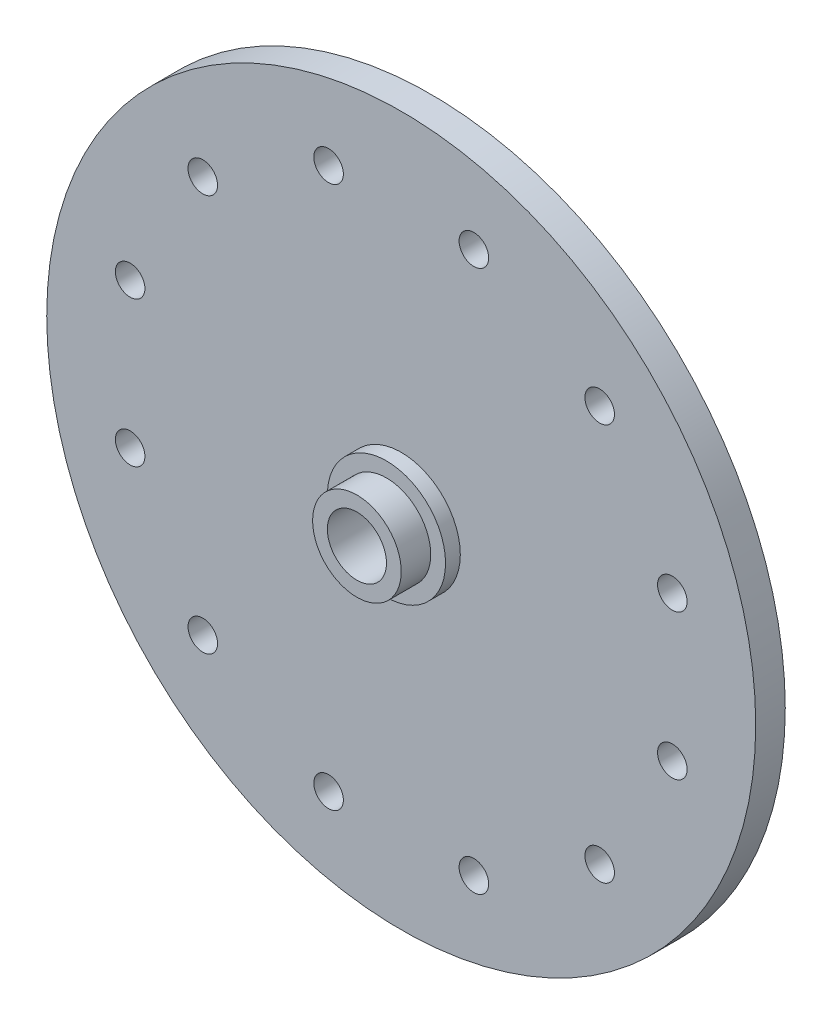
ISO-10303-21;
HEADER;
FILE_DESCRIPTION(('STEP AP214'),'2;1');
FILE_NAME('part.step','',(''),(''),'','','');
FILE_SCHEMA(('AUTOMOTIVE_DESIGN { 1 0 10303 214 1 1 1 1 }'));
ENDSEC;
DATA;
#1=APPLICATION_CONTEXT('core data for automotive mechanical design processes');
#2=APPLICATION_PROTOCOL_DEFINITION('international standard','automotive_design',2000,#1);
#3=PRODUCT_CONTEXT('',#1,'mechanical');
#4=PRODUCT('Part','Part','',(#3));
#5=PRODUCT_RELATED_PRODUCT_CATEGORY('part','',(#4));
#6=PRODUCT_DEFINITION_FORMATION('','',#4);
#7=PRODUCT_DEFINITION_CONTEXT('part definition',#1,'design');
#8=PRODUCT_DEFINITION('design','',#6,#7);
#9=PRODUCT_DEFINITION_SHAPE('','',#8);
#10=(LENGTH_UNIT() NAMED_UNIT(*) SI_UNIT(.MILLI.,.METRE.));
#11=(NAMED_UNIT(*) PLANE_ANGLE_UNIT() SI_UNIT($,.RADIAN.));
#12=(NAMED_UNIT(*) SI_UNIT($,.STERADIAN.) SOLID_ANGLE_UNIT());
#13=UNCERTAINTY_MEASURE_WITH_UNIT(LENGTH_MEASURE(1.E-05),#10,'distance_accuracy_value','');
#14=(GEOMETRIC_REPRESENTATION_CONTEXT(3) GLOBAL_UNCERTAINTY_ASSIGNED_CONTEXT((#13)) GLOBAL_UNIT_ASSIGNED_CONTEXT((#10,
#11,#12)) REPRESENTATION_CONTEXT('',''));
#15=CARTESIAN_POINT('',(0.,0.,0.));
#16=DIRECTION('',(0.,0.,1.));
#17=DIRECTION('',(1.,0.,0.));
#18=AXIS2_PLACEMENT_3D('',#15,#16,#17);
#19=CARTESIAN_POINT('',(0.,0.,-12.7));
#20=DIRECTION('',(0.,0.,1.));
#21=DIRECTION('',(1.,0.,0.));
#22=AXIS2_PLACEMENT_3D('',#19,#20,#21);
#23=CYLINDRICAL_SURFACE('',#22,152.4);
#24=CARTESIAN_POINT('',(0.,0.,-12.7));
#25=DIRECTION('',(0.,0.,1.));
#26=DIRECTION('',(1.,0.,0.));
#27=AXIS2_PLACEMENT_3D('',#24,#25,#26);
#28=CIRCLE('',#27,152.4);
#29=CARTESIAN_POINT('',(152.4,0.,-12.7));
#30=VERTEX_POINT('',#29);
#31=EDGE_CURVE('E10',#30,#30,#28,.T.);
#32=ORIENTED_EDGE('',*,*,#31,.T.);
#33=EDGE_LOOP('',(#32));
#34=FACE_BOUND('',#33,.T.);
#35=CARTESIAN_POINT('',(0.,0.,0.));
#36=DIRECTION('',(0.,0.,1.));
#37=DIRECTION('',(1.,0.,0.));
#38=AXIS2_PLACEMENT_3D('',#35,#36,#37);
#39=CIRCLE('',#38,152.4);
#40=CARTESIAN_POINT('',(152.4,0.,0.));
#41=VERTEX_POINT('',#40);
#42=EDGE_CURVE('E39',#41,#41,#39,.T.);
#43=ORIENTED_EDGE('',*,*,#42,.F.);
#44=EDGE_LOOP('',(#43));
#45=FACE_BOUND('',#44,.T.);
#46=ADVANCED_FACE('F32',(#34,#45),#23,.T.);
#47=CARTESIAN_POINT('',(0.,0.,-12.7));
#48=DIRECTION('',(0.,0.,1.));
#49=DIRECTION('',(1.,0.,0.));
#50=AXIS2_PLACEMENT_3D('',#47,#48,#49);
#51=PLANE('',#50);
#52=CARTESIAN_POINT('',(116.538950941776,31.2265177916211,-12.7));
#53=DIRECTION('',(0.,0.,1.));
#54=DIRECTION('',(0.866025403784446,-0.499999999999987,0.));
#55=AXIS2_PLACEMENT_3D('',#52,#53,#54);
#56=CIRCLE('',#55,6.34999999999999);
#57=CARTESIAN_POINT('',(122.038212255807,28.0515177916211,-12.7));
#58=VERTEX_POINT('',#57);
#59=EDGE_CURVE('E94',#58,#58,#56,.T.);
#60=ORIENTED_EDGE('',*,*,#59,.T.);
#61=EDGE_LOOP('',(#60));
#62=FACE_BOUND('',#61,.T.);
#63=CARTESIAN_POINT('',(116.538950941777,-31.2265177916173,-12.7));
#64=DIRECTION('',(0.,0.,1.));
#65=DIRECTION('',(0.500000000000012,-0.866025403784432,0.));
#66=AXIS2_PLACEMENT_3D('',#63,#64,#65);
#67=CIRCLE('',#66,6.34999999999999);
#68=CARTESIAN_POINT('',(119.713950941777,-36.7257791056485,-12.7));
#69=VERTEX_POINT('',#68);
#70=EDGE_CURVE('E101',#69,#69,#67,.T.);
#71=ORIENTED_EDGE('',*,*,#70,.T.);
#72=EDGE_LOOP('',(#71));
#73=FACE_BOUND('',#72,.T.);
#74=CARTESIAN_POINT('',(85.3124331501583,-85.3124331501556,-12.7));
#75=DIRECTION('',(0.,0.,1.));
#76=DIRECTION('',(0.,-1.,0.));
#77=AXIS2_PLACEMENT_3D('',#74,#75,#76);
#78=CIRCLE('',#77,6.34999999999999);
#79=CARTESIAN_POINT('',(85.3124331501584,-91.6624331501556,-12.7));
#80=VERTEX_POINT('',#79);
#81=EDGE_CURVE('E107',#80,#80,#78,.T.);
#82=ORIENTED_EDGE('',*,*,#81,.T.);
#83=EDGE_LOOP('',(#82));
#84=FACE_BOUND('',#83,.T.);
#85=CARTESIAN_POINT('',(31.2265177916209,-116.538950941776,-12.7));
#86=DIRECTION('',(0.,0.,1.));
#87=DIRECTION('',(-0.499999999999989,-0.866025403784445,0.));
#88=AXIS2_PLACEMENT_3D('',#85,#86,#87);
#89=CIRCLE('',#88,6.34999999999999);
#90=CARTESIAN_POINT('',(28.0515177916209,-122.038212255807,-12.7));
#91=VERTEX_POINT('',#90);
#92=EDGE_CURVE('E113',#91,#91,#89,.T.);
#93=ORIENTED_EDGE('',*,*,#92,.T.);
#94=EDGE_LOOP('',(#93));
#95=FACE_BOUND('',#94,.T.);
#96=CARTESIAN_POINT('',(-31.2265177916173,-116.538950941777,-12.7));
#97=DIRECTION('',(0.,0.,1.));
#98=DIRECTION('',(-0.866025403784432,-0.500000000000012,0.));
#99=AXIS2_PLACEMENT_3D('',#96,#97,#98);
#100=CIRCLE('',#99,6.34999999999999);
#101=CARTESIAN_POINT('',(-36.7257791056484,-119.713950941777,-12.7));
#102=VERTEX_POINT('',#101);
#103=EDGE_CURVE('E65',#102,#102,#100,.T.);
#104=ORIENTED_EDGE('',*,*,#103,.T.);
#105=EDGE_LOOP('',(#104));
#106=FACE_BOUND('',#105,.T.);
#107=CARTESIAN_POINT('',(-85.3124331501569,-85.312433150157,-12.7));
#108=DIRECTION('',(0.,0.,1.));
#109=DIRECTION('',(-1.,0.,0.));
#110=AXIS2_PLACEMENT_3D('',#107,#108,#109);
#111=CIRCLE('',#110,6.34999999999999);
#112=CARTESIAN_POINT('',(-91.6624331501569,-85.312433150157,-12.7));
#113=VERTEX_POINT('',#112);
#114=EDGE_CURVE('E64',#113,#113,#111,.T.);
#115=ORIENTED_EDGE('',*,*,#114,.T.);
#116=EDGE_LOOP('',(#115));
#117=FACE_BOUND('',#116,.T.);
#118=CARTESIAN_POINT('',(-116.538950941776,-31.2265177916192,-12.7));
#119=DIRECTION('',(0.,0.,1.));
#120=DIRECTION('',(-0.866025403784438,0.500000000000001,0.));
#121=AXIS2_PLACEMENT_3D('',#118,#119,#120);
#122=CIRCLE('',#121,6.34999999999999);
#123=CARTESIAN_POINT('',(-122.038212255807,-28.0515177916192,-12.7));
#124=VERTEX_POINT('',#123);
#125=EDGE_CURVE('E71',#124,#124,#122,.T.);
#126=ORIENTED_EDGE('',*,*,#125,.T.);
#127=EDGE_LOOP('',(#126));
#128=FACE_BOUND('',#127,.T.);
#129=CARTESIAN_POINT('',(-116.538950941776,31.226517791619,-12.7));
#130=DIRECTION('',(0.,0.,1.));
#131=DIRECTION('',(-0.499999999999999,0.866025403784439,0.));
#132=AXIS2_PLACEMENT_3D('',#129,#130,#131);
#133=CIRCLE('',#132,6.34999999999999);
#134=CARTESIAN_POINT('',(-119.713950941776,36.7257791056502,-12.7));
#135=VERTEX_POINT('',#134);
#136=EDGE_CURVE('E77',#135,#135,#133,.T.);
#137=ORIENTED_EDGE('',*,*,#136,.T.);
#138=EDGE_LOOP('',(#137));
#139=FACE_BOUND('',#138,.T.);
#140=CARTESIAN_POINT('',(-85.3124331501571,85.3124331501568,-12.7));
#141=DIRECTION('',(0.,0.,1.));
#142=DIRECTION('',(0.,1.,0.));
#143=AXIS2_PLACEMENT_3D('',#140,#141,#142);
#144=CIRCLE('',#143,6.34999999999999);
#145=CARTESIAN_POINT('',(-85.3124331501571,91.6624331501568,-12.7));
#146=VERTEX_POINT('',#145);
#147=EDGE_CURVE('E83',#146,#146,#144,.T.);
#148=ORIENTED_EDGE('',*,*,#147,.T.);
#149=EDGE_LOOP('',(#148));
#150=FACE_BOUND('',#149,.T.);
#151=CARTESIAN_POINT('',(-31.2265177916194,116.538950941776,-12.7));
#152=DIRECTION('',(0.,0.,1.));
#153=DIRECTION('',(0.5,0.866025403784439,0.));
#154=AXIS2_PLACEMENT_3D('',#151,#152,#153);
#155=CIRCLE('',#154,6.34999999999999);
#156=CARTESIAN_POINT('',(-28.0515177916194,122.038212255807,-12.7));
#157=VERTEX_POINT('',#156);
#158=EDGE_CURVE('E58',#157,#157,#155,.T.);
#159=ORIENTED_EDGE('',*,*,#158,.T.);
#160=EDGE_LOOP('',(#159));
#161=FACE_BOUND('',#160,.T.);
#162=CARTESIAN_POINT('',(31.226517791619,116.538950941776,-12.7));
#163=DIRECTION('',(0.,0.,1.));
#164=DIRECTION('',(0.866025403784439,0.499999999999999,0.));
#165=AXIS2_PLACEMENT_3D('',#162,#163,#164);
#166=CIRCLE('',#165,6.34999999999999);
#167=CARTESIAN_POINT('',(36.7257791056502,119.713950941776,-12.7));
#168=VERTEX_POINT('',#167);
#169=EDGE_CURVE('E52',#168,#168,#166,.T.);
#170=ORIENTED_EDGE('',*,*,#169,.T.);
#171=EDGE_LOOP('',(#170));
#172=FACE_BOUND('',#171,.T.);
#173=CARTESIAN_POINT('',(85.3124331501568,85.3124331501571,-12.7));
#174=DIRECTION('',(0.,0.,1.));
#175=DIRECTION('',(1.,0.,0.));
#176=AXIS2_PLACEMENT_3D('',#173,#174,#175);
#177=CIRCLE('',#176,6.34999999999999);
#178=CARTESIAN_POINT('',(91.6624331501568,85.3124331501571,-12.7));
#179=VERTEX_POINT('',#178);
#180=EDGE_CURVE('E48',#179,#179,#177,.T.);
#181=ORIENTED_EDGE('',*,*,#180,.T.);
#182=EDGE_LOOP('',(#181));
#183=FACE_BOUND('',#182,.T.);
#184=CARTESIAN_POINT('',(0.,0.,-12.7));
#185=DIRECTION('',(0.,0.,1.));
#186=DIRECTION('',(1.,0.,0.));
#187=AXIS2_PLACEMENT_3D('',#184,#185,#186);
#188=CIRCLE('',#187,12.7);
#189=CARTESIAN_POINT('',(12.7,0.,-12.7));
#190=VERTEX_POINT('',#189);
#191=EDGE_CURVE('E44',#190,#190,#188,.T.);
#192=ORIENTED_EDGE('',*,*,#191,.T.);
#193=EDGE_LOOP('',(#192));
#194=FACE_BOUND('',#193,.T.);
#195=ORIENTED_EDGE('',*,*,#31,.F.);
#196=EDGE_LOOP('',(#195));
#197=FACE_BOUND('',#196,.T.);
#198=ADVANCED_FACE('F149',(#62,#73,#84,#95,#106,#117,#128,#139,#150,#161,#172,#183,#194,#197),
#51,.F.);
#199=CARTESIAN_POINT('',(0.,0.,0.));
#200=DIRECTION('',(0.,0.,1.));
#201=DIRECTION('',(1.,0.,0.));
#202=AXIS2_PLACEMENT_3D('',#199,#200,#201);
#203=PLANE('',#202);
#204=CARTESIAN_POINT('',(0.,0.,0.));
#205=DIRECTION('',(0.,0.,1.));
#206=DIRECTION('',(1.,0.,0.));
#207=AXIS2_PLACEMENT_3D('',#204,#205,#206);
#208=CIRCLE('',#207,25.4);
#209=CARTESIAN_POINT('',(25.4,0.,0.));
#210=VERTEX_POINT('',#209);
#211=EDGE_CURVE('E123',#210,#210,#208,.T.);
#212=ORIENTED_EDGE('',*,*,#211,.F.);
#213=EDGE_LOOP('',(#212));
#214=FACE_BOUND('',#213,.T.);
#215=CARTESIAN_POINT('',(116.538950941776,31.2265177916211,0.));
#216=DIRECTION('',(0.,0.,1.));
#217=DIRECTION('',(0.866025403784446,-0.499999999999987,0.));
#218=AXIS2_PLACEMENT_3D('',#215,#216,#217);
#219=CIRCLE('',#218,6.34999999999999);
#220=CARTESIAN_POINT('',(122.038212255807,28.0515177916211,0.));
#221=VERTEX_POINT('',#220);
#222=EDGE_CURVE('E91',#221,#221,#219,.T.);
#223=ORIENTED_EDGE('',*,*,#222,.F.);
#224=EDGE_LOOP('',(#223));
#225=FACE_BOUND('',#224,.T.);
#226=CARTESIAN_POINT('',(116.538950941777,-31.2265177916173,0.));
#227=DIRECTION('',(0.,0.,1.));
#228=DIRECTION('',(0.500000000000012,-0.866025403784432,0.));
#229=AXIS2_PLACEMENT_3D('',#226,#227,#228);
#230=CIRCLE('',#229,6.34999999999999);
#231=CARTESIAN_POINT('',(119.713950941777,-36.7257791056485,0.));
#232=VERTEX_POINT('',#231);
#233=EDGE_CURVE('E98',#232,#232,#230,.T.);
#234=ORIENTED_EDGE('',*,*,#233,.F.);
#235=EDGE_LOOP('',(#234));
#236=FACE_BOUND('',#235,.T.);
#237=CARTESIAN_POINT('',(85.3124331501583,-85.3124331501556,0.));
#238=DIRECTION('',(0.,0.,1.));
#239=DIRECTION('',(0.,-1.,0.));
#240=AXIS2_PLACEMENT_3D('',#237,#238,#239);
#241=CIRCLE('',#240,6.34999999999999);
#242=CARTESIAN_POINT('',(85.3124331501584,-91.6624331501556,0.));
#243=VERTEX_POINT('',#242);
#244=EDGE_CURVE('E104',#243,#243,#241,.T.);
#245=ORIENTED_EDGE('',*,*,#244,.F.);
#246=EDGE_LOOP('',(#245));
#247=FACE_BOUND('',#246,.T.);
#248=CARTESIAN_POINT('',(31.2265177916209,-116.538950941776,0.));
#249=DIRECTION('',(0.,0.,1.));
#250=DIRECTION('',(-0.499999999999989,-0.866025403784445,0.));
#251=AXIS2_PLACEMENT_3D('',#248,#249,#250);
#252=CIRCLE('',#251,6.34999999999999);
#253=CARTESIAN_POINT('',(28.0515177916209,-122.038212255807,0.));
#254=VERTEX_POINT('',#253);
#255=EDGE_CURVE('E110',#254,#254,#252,.T.);
#256=ORIENTED_EDGE('',*,*,#255,.F.);
#257=EDGE_LOOP('',(#256));
#258=FACE_BOUND('',#257,.T.);
#259=CARTESIAN_POINT('',(-31.2265177916173,-116.538950941777,0.));
#260=DIRECTION('',(0.,0.,1.));
#261=DIRECTION('',(-0.866025403784432,-0.500000000000012,0.));
#262=AXIS2_PLACEMENT_3D('',#259,#260,#261);
#263=CIRCLE('',#262,6.34999999999999);
#264=CARTESIAN_POINT('',(-36.7257791056484,-119.713950941777,0.));
#265=VERTEX_POINT('',#264);
#266=EDGE_CURVE('E116',#265,#265,#263,.T.);
#267=ORIENTED_EDGE('',*,*,#266,.F.);
#268=EDGE_LOOP('',(#267));
#269=FACE_BOUND('',#268,.T.);
#270=CARTESIAN_POINT('',(-85.3124331501569,-85.312433150157,0.));
#271=DIRECTION('',(0.,0.,1.));
#272=DIRECTION('',(-1.,0.,0.));
#273=AXIS2_PLACEMENT_3D('',#270,#271,#272);
#274=CIRCLE('',#273,6.34999999999999);
#275=CARTESIAN_POINT('',(-91.6624331501569,-85.312433150157,0.));
#276=VERTEX_POINT('',#275);
#277=EDGE_CURVE('E61',#276,#276,#274,.T.);
#278=ORIENTED_EDGE('',*,*,#277,.F.);
#279=EDGE_LOOP('',(#278));
#280=FACE_BOUND('',#279,.T.);
#281=CARTESIAN_POINT('',(-116.538950941776,-31.2265177916192,0.));
#282=DIRECTION('',(0.,0.,1.));
#283=DIRECTION('',(-0.866025403784438,0.500000000000001,0.));
#284=AXIS2_PLACEMENT_3D('',#281,#282,#283);
#285=CIRCLE('',#284,6.34999999999999);
#286=CARTESIAN_POINT('',(-122.038212255807,-28.0515177916192,0.));
#287=VERTEX_POINT('',#286);
#288=EDGE_CURVE('E68',#287,#287,#285,.T.);
#289=ORIENTED_EDGE('',*,*,#288,.F.);
#290=EDGE_LOOP('',(#289));
#291=FACE_BOUND('',#290,.T.);
#292=CARTESIAN_POINT('',(-116.538950941776,31.226517791619,0.));
#293=DIRECTION('',(0.,0.,1.));
#294=DIRECTION('',(-0.499999999999999,0.866025403784439,0.));
#295=AXIS2_PLACEMENT_3D('',#292,#293,#294);
#296=CIRCLE('',#295,6.34999999999999);
#297=CARTESIAN_POINT('',(-119.713950941776,36.7257791056502,0.));
#298=VERTEX_POINT('',#297);
#299=EDGE_CURVE('E74',#298,#298,#296,.T.);
#300=ORIENTED_EDGE('',*,*,#299,.F.);
#301=EDGE_LOOP('',(#300));
#302=FACE_BOUND('',#301,.T.);
#303=CARTESIAN_POINT('',(-85.3124331501571,85.3124331501568,0.));
#304=DIRECTION('',(0.,0.,1.));
#305=DIRECTION('',(0.,1.,0.));
#306=AXIS2_PLACEMENT_3D('',#303,#304,#305);
#307=CIRCLE('',#306,6.34999999999999);
#308=CARTESIAN_POINT('',(-85.3124331501571,91.6624331501568,0.));
#309=VERTEX_POINT('',#308);
#310=EDGE_CURVE('E80',#309,#309,#307,.T.);
#311=ORIENTED_EDGE('',*,*,#310,.F.);
#312=EDGE_LOOP('',(#311));
#313=FACE_BOUND('',#312,.T.);
#314=CARTESIAN_POINT('',(-31.2265177916194,116.538950941776,0.));
#315=DIRECTION('',(0.,0.,1.));
#316=DIRECTION('',(0.5,0.866025403784439,0.));
#317=AXIS2_PLACEMENT_3D('',#314,#315,#316);
#318=CIRCLE('',#317,6.34999999999999);
#319=CARTESIAN_POINT('',(-28.0515177916194,122.038212255807,0.));
#320=VERTEX_POINT('',#319);
#321=EDGE_CURVE('E86',#320,#320,#318,.T.);
#322=ORIENTED_EDGE('',*,*,#321,.F.);
#323=EDGE_LOOP('',(#322));
#324=FACE_BOUND('',#323,.T.);
#325=CARTESIAN_POINT('',(31.226517791619,116.538950941776,0.));
#326=DIRECTION('',(0.,0.,1.));
#327=DIRECTION('',(0.866025403784439,0.499999999999999,0.));
#328=AXIS2_PLACEMENT_3D('',#325,#326,#327);
#329=CIRCLE('',#328,6.34999999999999);
#330=CARTESIAN_POINT('',(36.7257791056502,119.713950941776,0.));
#331=VERTEX_POINT('',#330);
#332=EDGE_CURVE('E55',#331,#331,#329,.T.);
#333=ORIENTED_EDGE('',*,*,#332,.F.);
#334=EDGE_LOOP('',(#333));
#335=FACE_BOUND('',#334,.T.);
#336=CARTESIAN_POINT('',(85.3124331501568,85.3124331501571,0.));
#337=DIRECTION('',(0.,0.,1.));
#338=DIRECTION('',(1.,0.,0.));
#339=AXIS2_PLACEMENT_3D('',#336,#337,#338);
#340=CIRCLE('',#339,6.34999999999999);
#341=CARTESIAN_POINT('',(91.6624331501568,85.3124331501571,0.));
#342=VERTEX_POINT('',#341);
#343=EDGE_CURVE('E49',#342,#342,#340,.T.);
#344=ORIENTED_EDGE('',*,*,#343,.F.);
#345=EDGE_LOOP('',(#344));
#346=FACE_BOUND('',#345,.T.);
#347=ORIENTED_EDGE('',*,*,#42,.T.);
#348=EDGE_LOOP('',(#347));
#349=FACE_BOUND('',#348,.T.);
#350=ADVANCED_FACE('F139',(#214,#225,#236,#247,#258,#269,#280,#291,#302,#313,#324,#335,#346,
#349),#203,.T.);
#351=CARTESIAN_POINT('',(0.,0.,-12.7));
#352=DIRECTION('',(0.,0.,1.));
#353=DIRECTION('',(1.,0.,0.));
#354=AXIS2_PLACEMENT_3D('',#351,#352,#353);
#355=CYLINDRICAL_SURFACE('',#354,12.7);
#356=ORIENTED_EDGE('',*,*,#191,.F.);
#357=EDGE_LOOP('',(#356));
#358=FACE_BOUND('',#357,.T.);
#359=CARTESIAN_POINT('',(0.,0.,19.05));
#360=DIRECTION('',(0.,0.,-1.));
#361=DIRECTION('',(-1.,0.,0.));
#362=AXIS2_PLACEMENT_3D('',#359,#360,#361);
#363=CIRCLE('',#362,12.7);
#364=CARTESIAN_POINT('',(-12.7,0.,19.05));
#365=VERTEX_POINT('',#364);
#366=EDGE_CURVE('E127',#365,#365,#363,.T.);
#367=ORIENTED_EDGE('',*,*,#366,.F.);
#368=EDGE_LOOP('',(#367));
#369=FACE_BOUND('',#368,.T.);
#370=ADVANCED_FACE('F136',(#358,#369),#355,.F.);
#371=CARTESIAN_POINT('',(85.3124331501568,85.3124331501571,-12.7));
#372=DIRECTION('',(0.,0.,1.));
#373=DIRECTION('',(1.,0.,0.));
#374=AXIS2_PLACEMENT_3D('',#371,#372,#373);
#375=CYLINDRICAL_SURFACE('',#374,6.34999999999999);
#376=ORIENTED_EDGE('',*,*,#180,.F.);
#377=EDGE_LOOP('',(#376));
#378=FACE_BOUND('',#377,.T.);
#379=ORIENTED_EDGE('',*,*,#343,.T.);
#380=EDGE_LOOP('',(#379));
#381=FACE_BOUND('',#380,.T.);
#382=ADVANCED_FACE('F138',(#378,#381),#375,.F.);
#383=CARTESIAN_POINT('',(31.226517791619,116.538950941776,-12.7));
#384=DIRECTION('',(0.,0.,1.));
#385=DIRECTION('',(1.,0.,0.));
#386=AXIS2_PLACEMENT_3D('',#383,#384,#385);
#387=CYLINDRICAL_SURFACE('',#386,6.34999999999999);
#388=ORIENTED_EDGE('',*,*,#169,.F.);
#389=EDGE_LOOP('',(#388));
#390=FACE_BOUND('',#389,.T.);
#391=ORIENTED_EDGE('',*,*,#332,.T.);
#392=EDGE_LOOP('',(#391));
#393=FACE_BOUND('',#392,.T.);
#394=ADVANCED_FACE('F146',(#390,#393),#387,.F.);
#395=CARTESIAN_POINT('',(-31.2265177916194,116.538950941776,-12.7));
#396=DIRECTION('',(0.,0.,1.));
#397=DIRECTION('',(1.,0.,0.));
#398=AXIS2_PLACEMENT_3D('',#395,#396,#397);
#399=CYLINDRICAL_SURFACE('',#398,6.34999999999999);
#400=ORIENTED_EDGE('',*,*,#158,.F.);
#401=EDGE_LOOP('',(#400));
#402=FACE_BOUND('',#401,.T.);
#403=ORIENTED_EDGE('',*,*,#321,.T.);
#404=EDGE_LOOP('',(#403));
#405=FACE_BOUND('',#404,.T.);
#406=ADVANCED_FACE('F194',(#402,#405),#399,.F.);
#407=CARTESIAN_POINT('',(-85.3124331501571,85.3124331501568,-12.7));
#408=DIRECTION('',(0.,0.,1.));
#409=DIRECTION('',(1.,0.,0.));
#410=AXIS2_PLACEMENT_3D('',#407,#408,#409);
#411=CYLINDRICAL_SURFACE('',#410,6.34999999999999);
#412=ORIENTED_EDGE('',*,*,#147,.F.);
#413=EDGE_LOOP('',(#412));
#414=FACE_BOUND('',#413,.T.);
#415=ORIENTED_EDGE('',*,*,#310,.T.);
#416=EDGE_LOOP('',(#415));
#417=FACE_BOUND('',#416,.T.);
#418=ADVANCED_FACE('F201',(#414,#417),#411,.F.);
#419=CARTESIAN_POINT('',(-116.538950941776,31.226517791619,-12.7));
#420=DIRECTION('',(0.,0.,1.));
#421=DIRECTION('',(1.,0.,0.));
#422=AXIS2_PLACEMENT_3D('',#419,#420,#421);
#423=CYLINDRICAL_SURFACE('',#422,6.34999999999999);
#424=ORIENTED_EDGE('',*,*,#136,.F.);
#425=EDGE_LOOP('',(#424));
#426=FACE_BOUND('',#425,.T.);
#427=ORIENTED_EDGE('',*,*,#299,.T.);
#428=EDGE_LOOP('',(#427));
#429=FACE_BOUND('',#428,.T.);
#430=ADVANCED_FACE('F213',(#426,#429),#423,.F.);
#431=CARTESIAN_POINT('',(-116.538950941776,-31.2265177916192,-12.7));
#432=DIRECTION('',(0.,0.,1.));
#433=DIRECTION('',(1.,0.,0.));
#434=AXIS2_PLACEMENT_3D('',#431,#432,#433);
#435=CYLINDRICAL_SURFACE('',#434,6.34999999999999);
#436=ORIENTED_EDGE('',*,*,#125,.F.);
#437=EDGE_LOOP('',(#436));
#438=FACE_BOUND('',#437,.T.);
#439=ORIENTED_EDGE('',*,*,#288,.T.);
#440=EDGE_LOOP('',(#439));
#441=FACE_BOUND('',#440,.T.);
#442=ADVANCED_FACE('F209',(#438,#441),#435,.F.);
#443=CARTESIAN_POINT('',(-85.3124331501569,-85.312433150157,-12.7));
#444=DIRECTION('',(0.,0.,1.));
#445=DIRECTION('',(1.,0.,0.));
#446=AXIS2_PLACEMENT_3D('',#443,#444,#445);
#447=CYLINDRICAL_SURFACE('',#446,6.34999999999999);
#448=ORIENTED_EDGE('',*,*,#114,.F.);
#449=EDGE_LOOP('',(#448));
#450=FACE_BOUND('',#449,.T.);
#451=ORIENTED_EDGE('',*,*,#277,.T.);
#452=EDGE_LOOP('',(#451));
#453=FACE_BOUND('',#452,.T.);
#454=ADVANCED_FACE('F205',(#450,#453),#447,.F.);
#455=CARTESIAN_POINT('',(-31.2265177916173,-116.538950941777,-12.7));
#456=DIRECTION('',(0.,0.,1.));
#457=DIRECTION('',(1.,0.,0.));
#458=AXIS2_PLACEMENT_3D('',#455,#456,#457);
#459=CYLINDRICAL_SURFACE('',#458,6.34999999999999);
#460=ORIENTED_EDGE('',*,*,#103,.F.);
#461=EDGE_LOOP('',(#460));
#462=FACE_BOUND('',#461,.T.);
#463=ORIENTED_EDGE('',*,*,#266,.T.);
#464=EDGE_LOOP('',(#463));
#465=FACE_BOUND('',#464,.T.);
#466=ADVANCED_FACE('F208',(#462,#465),#459,.F.);
#467=CARTESIAN_POINT('',(31.2265177916209,-116.538950941776,-12.7));
#468=DIRECTION('',(0.,0.,1.));
#469=DIRECTION('',(1.,0.,0.));
#470=AXIS2_PLACEMENT_3D('',#467,#468,#469);
#471=CYLINDRICAL_SURFACE('',#470,6.34999999999999);
#472=ORIENTED_EDGE('',*,*,#92,.F.);
#473=EDGE_LOOP('',(#472));
#474=FACE_BOUND('',#473,.T.);
#475=ORIENTED_EDGE('',*,*,#255,.T.);
#476=EDGE_LOOP('',(#475));
#477=FACE_BOUND('',#476,.T.);
#478=ADVANCED_FACE('F233',(#474,#477),#471,.F.);
#479=CARTESIAN_POINT('',(85.3124331501583,-85.3124331501556,-12.7));
#480=DIRECTION('',(0.,0.,1.));
#481=DIRECTION('',(1.,0.,0.));
#482=AXIS2_PLACEMENT_3D('',#479,#480,#481);
#483=CYLINDRICAL_SURFACE('',#482,6.34999999999999);
#484=ORIENTED_EDGE('',*,*,#81,.F.);
#485=EDGE_LOOP('',(#484));
#486=FACE_BOUND('',#485,.T.);
#487=ORIENTED_EDGE('',*,*,#244,.T.);
#488=EDGE_LOOP('',(#487));
#489=FACE_BOUND('',#488,.T.);
#490=ADVANCED_FACE('F229',(#486,#489),#483,.F.);
#491=CARTESIAN_POINT('',(116.538950941777,-31.2265177916173,-12.7));
#492=DIRECTION('',(0.,0.,1.));
#493=DIRECTION('',(1.,0.,0.));
#494=AXIS2_PLACEMENT_3D('',#491,#492,#493);
#495=CYLINDRICAL_SURFACE('',#494,6.34999999999999);
#496=ORIENTED_EDGE('',*,*,#70,.F.);
#497=EDGE_LOOP('',(#496));
#498=FACE_BOUND('',#497,.T.);
#499=ORIENTED_EDGE('',*,*,#233,.T.);
#500=EDGE_LOOP('',(#499));
#501=FACE_BOUND('',#500,.T.);
#502=ADVANCED_FACE('F225',(#498,#501),#495,.F.);
#503=CARTESIAN_POINT('',(116.538950941776,31.2265177916211,-12.7));
#504=DIRECTION('',(0.,0.,1.));
#505=DIRECTION('',(1.,0.,0.));
#506=AXIS2_PLACEMENT_3D('',#503,#504,#505);
#507=CYLINDRICAL_SURFACE('',#506,6.34999999999999);
#508=ORIENTED_EDGE('',*,*,#59,.F.);
#509=EDGE_LOOP('',(#508));
#510=FACE_BOUND('',#509,.T.);
#511=ORIENTED_EDGE('',*,*,#222,.T.);
#512=EDGE_LOOP('',(#511));
#513=FACE_BOUND('',#512,.T.);
#514=ADVANCED_FACE('F221',(#510,#513),#507,.F.);
#515=CARTESIAN_POINT('',(0.,0.,6.35));
#516=DIRECTION('',(0.,0.,-1.));
#517=DIRECTION('',(-1.,0.,0.));
#518=AXIS2_PLACEMENT_3D('',#515,#516,#517);
#519=CYLINDRICAL_SURFACE('',#518,25.4);
#520=CARTESIAN_POINT('',(0.,0.,6.35));
#521=DIRECTION('',(0.,0.,1.));
#522=DIRECTION('',(1.,0.,0.));
#523=AXIS2_PLACEMENT_3D('',#520,#521,#522);
#524=CIRCLE('',#523,25.4);
#525=CARTESIAN_POINT('',(25.4,0.,6.35));
#526=VERTEX_POINT('',#525);
#527=EDGE_CURVE('E126',#526,#526,#524,.T.);
#528=ORIENTED_EDGE('',*,*,#527,.F.);
#529=EDGE_LOOP('',(#528));
#530=FACE_BOUND('',#529,.T.);
#531=ORIENTED_EDGE('',*,*,#211,.T.);
#532=EDGE_LOOP('',(#531));
#533=FACE_BOUND('',#532,.T.);
#534=ADVANCED_FACE('F224',(#530,#533),#519,.T.);
#535=CARTESIAN_POINT('',(0.,0.,6.35));
#536=DIRECTION('',(0.,0.,1.));
#537=DIRECTION('',(1.,0.,0.));
#538=AXIS2_PLACEMENT_3D('',#535,#536,#537);
#539=PLANE('',#538);
#540=CARTESIAN_POINT('',(0.,0.,6.35));
#541=DIRECTION('',(0.,0.,1.));
#542=DIRECTION('',(1.,0.,0.));
#543=AXIS2_PLACEMENT_3D('',#540,#541,#542);
#544=CIRCLE('',#543,19.05);
#545=CARTESIAN_POINT('',(-19.05,0.,6.35));
#546=VERTEX_POINT('',#545);
#547=EDGE_CURVE('E35',#546,#546,#544,.T.);
#548=ORIENTED_EDGE('',*,*,#547,.F.);
#549=EDGE_LOOP('',(#548));
#550=FACE_BOUND('',#549,.T.);
#551=ORIENTED_EDGE('',*,*,#527,.T.);
#552=EDGE_LOOP('',(#551));
#553=FACE_BOUND('',#552,.T.);
#554=ADVANCED_FACE('F247',(#550,#553),#539,.T.);
#555=CARTESIAN_POINT('',(0.,0.,19.05));
#556=DIRECTION('',(0.,0.,1.));
#557=DIRECTION('',(1.,0.,0.));
#558=AXIS2_PLACEMENT_3D('',#555,#556,#557);
#559=PLANE('',#558);
#560=ORIENTED_EDGE('',*,*,#366,.T.);
#561=EDGE_LOOP('',(#560));
#562=FACE_BOUND('',#561,.T.);
#563=CARTESIAN_POINT('',(0.,0.,19.05));
#564=DIRECTION('',(0.,0.,1.));
#565=DIRECTION('',(1.,0.,0.));
#566=AXIS2_PLACEMENT_3D('',#563,#564,#565);
#567=CIRCLE('',#566,19.05);
#568=CARTESIAN_POINT('',(-19.05,0.,19.05));
#569=VERTEX_POINT('',#568);
#570=EDGE_CURVE('E95',#569,#569,#567,.T.);
#571=ORIENTED_EDGE('',*,*,#570,.T.);
#572=EDGE_LOOP('',(#571));
#573=FACE_BOUND('',#572,.T.);
#574=ADVANCED_FACE('F133',(#562,#573),#559,.T.);
#575=CARTESIAN_POINT('',(0.,0.,19.05));
#576=DIRECTION('',(0.,0.,-1.));
#577=DIRECTION('',(-1.,0.,0.));
#578=AXIS2_PLACEMENT_3D('',#575,#576,#577);
#579=CYLINDRICAL_SURFACE('',#578,19.05);
#580=CARTESIAN_POINT('',(-19.05,0.,6.35));
#581=CARTESIAN_POINT('',(-19.05,0.,6.48229166666667));
#582=CARTESIAN_POINT('',(-19.05,0.,6.61458333333333));
#583=CARTESIAN_POINT('',(-19.05,0.,6.87916666666667));
#584=CARTESIAN_POINT('',(-19.05,0.,7.01145833333333));
#585=CARTESIAN_POINT('',(-19.05,0.,7.27604166666667));
#586=CARTESIAN_POINT('',(-19.05,0.,7.40833333333333));
#587=CARTESIAN_POINT('',(-19.05,0.,7.67291666666667));
#588=CARTESIAN_POINT('',(-19.05,0.,7.80520833333333));
#589=CARTESIAN_POINT('',(-19.05,0.,8.06979166666667));
#590=CARTESIAN_POINT('',(-19.05,0.,8.20208333333333));
#591=CARTESIAN_POINT('',(-19.05,0.,8.46666666666667));
#592=CARTESIAN_POINT('',(-19.05,0.,8.59895833333333));
#593=CARTESIAN_POINT('',(-19.05,0.,8.86354166666666));
#594=CARTESIAN_POINT('',(-19.05,0.,8.99583333333333));
#595=CARTESIAN_POINT('',(-19.05,0.,9.26041666666667));
#596=CARTESIAN_POINT('',(-19.05,0.,9.39270833333333));
#597=CARTESIAN_POINT('',(-19.05,0.,9.65729166666667));
#598=CARTESIAN_POINT('',(-19.05,0.,9.78958333333333));
#599=CARTESIAN_POINT('',(-19.05,0.,10.0541666666667));
#600=CARTESIAN_POINT('',(-19.05,0.,10.1864583333333));
#601=CARTESIAN_POINT('',(-19.05,0.,10.4510416666667));
#602=CARTESIAN_POINT('',(-19.05,0.,10.5833333333333));
#603=CARTESIAN_POINT('',(-19.05,0.,10.8479166666667));
#604=CARTESIAN_POINT('',(-19.05,0.,10.9802083333333));
#605=CARTESIAN_POINT('',(-19.05,0.,11.2447916666667));
#606=CARTESIAN_POINT('',(-19.05,0.,11.3770833333333));
#607=CARTESIAN_POINT('',(-19.05,0.,11.6416666666667));
#608=CARTESIAN_POINT('',(-19.05,0.,11.7739583333333));
#609=CARTESIAN_POINT('',(-19.05,0.,12.0385416666667));
#610=CARTESIAN_POINT('',(-19.05,0.,12.1708333333333));
#611=CARTESIAN_POINT('',(-19.05,0.,12.4354166666667));
#612=CARTESIAN_POINT('',(-19.05,0.,12.5677083333333));
#613=CARTESIAN_POINT('',(-19.05,0.,12.8322916666667));
#614=CARTESIAN_POINT('',(-19.05,0.,12.9645833333333));
#615=CARTESIAN_POINT('',(-19.05,0.,13.2291666666667));
#616=CARTESIAN_POINT('',(-19.05,0.,13.3614583333333));
#617=CARTESIAN_POINT('',(-19.05,0.,13.6260416666667));
#618=CARTESIAN_POINT('',(-19.05,0.,13.7583333333333));
#619=CARTESIAN_POINT('',(-19.05,0.,14.0229166666667));
#620=CARTESIAN_POINT('',(-19.05,0.,14.1552083333333));
#621=CARTESIAN_POINT('',(-19.05,0.,14.4197916666667));
#622=CARTESIAN_POINT('',(-19.05,0.,14.5520833333333));
#623=CARTESIAN_POINT('',(-19.05,0.,14.8166666666667));
#624=CARTESIAN_POINT('',(-19.05,0.,14.9489583333333));
#625=CARTESIAN_POINT('',(-19.05,0.,15.2135416666667));
#626=CARTESIAN_POINT('',(-19.05,0.,15.3458333333333));
#627=CARTESIAN_POINT('',(-19.05,0.,15.6104166666667));
#628=CARTESIAN_POINT('',(-19.05,0.,15.7427083333333));
#629=CARTESIAN_POINT('',(-19.05,0.,16.0072916666667));
#630=CARTESIAN_POINT('',(-19.05,0.,16.1395833333333));
#631=CARTESIAN_POINT('',(-19.05,0.,16.4041666666667));
#632=CARTESIAN_POINT('',(-19.05,0.,16.5364583333333));
#633=CARTESIAN_POINT('',(-19.05,0.,16.8010416666667));
#634=CARTESIAN_POINT('',(-19.05,0.,16.9333333333333));
#635=CARTESIAN_POINT('',(-19.05,0.,17.1979166666667));
#636=CARTESIAN_POINT('',(-19.05,0.,17.3302083333333));
#637=CARTESIAN_POINT('',(-19.05,0.,17.5947916666667));
#638=CARTESIAN_POINT('',(-19.05,0.,17.7270833333333));
#639=CARTESIAN_POINT('',(-19.05,0.,17.9916666666667));
#640=CARTESIAN_POINT('',(-19.05,0.,18.1239583333333));
#641=CARTESIAN_POINT('',(-19.05,0.,18.3885416666667));
#642=CARTESIAN_POINT('',(-19.05,0.,18.5208333333333));
#643=CARTESIAN_POINT('',(-19.05,0.,18.7854166666667));
#644=CARTESIAN_POINT('',(-19.05,0.,18.9177083333333));
#645=CARTESIAN_POINT('',(-19.05,0.,19.05));
#646=B_SPLINE_CURVE_WITH_KNOTS('',3,(#580,#581,#582,#583,#584,#585,#586,#587,#588,#589,#590,
#591,#592,#593,#594,#595,#596,#597,#598,#599,#600,#601,#602,#603,#604,#605,#606,#607,#608,#609,
#610,#611,#612,#613,#614,#615,#616,#617,#618,#619,#620,#621,#622,#623,#624,#625,#626,#627,#628,
#629,#630,#631,#632,#633,#634,#635,#636,#637,#638,#639,#640,#641,#642,#643,#644,#645),
.UNSPECIFIED.,.F.,.F.,(4,2,2,2,2,2,2,2,2,2,2,2,2,2,2,2,2,2,2,2,2,2,2,2,2,2,2,2,2,2,2,2,4),(0.,
0.396875,0.793749999999999,1.190625,1.5875,1.984375,2.38125,2.778125,3.175,3.571875,3.96875,
4.365625,4.7625,5.159375,5.55625,5.953125,6.35,6.746875,7.14375,7.540625,7.9375,8.334375,
8.73125,9.128125,9.525,9.921875,10.31875,10.715625,11.1125,11.509375,11.90625,12.303125,12.7),.UNSPECIFIED.);
#647=EDGE_CURVE('BSEAM241',#546,#569,#646,.T.);
#648=ORIENTED_EDGE('',*,*,#547,.T.);
#649=ORIENTED_EDGE('',*,*,#570,.F.);
#650=ORIENTED_EDGE('',*,*,#647,.T.);
#651=ORIENTED_EDGE('',*,*,#647,.F.);
#652=EDGE_LOOP('',(#648,#650,#649,#651));
#653=FACE_BOUND('',#652,.T.);
#654=ADVANCED_FACE('F241',(#653),#579,.T.);
#655=CLOSED_SHELL('',(#46,#198,#350,#370,#382,#394,#406,#418,#430,#442,#454,#466,#478,#490,#502,
#514,#534,#554,#574,#654));
#656=MANIFOLD_SOLID_BREP('B2',#655);
#657=ADVANCED_BREP_SHAPE_REPRESENTATION('',(#18,#656),#14);
#658=SHAPE_DEFINITION_REPRESENTATION(#9,#657);
ENDSEC;
END-ISO-10303-21;
